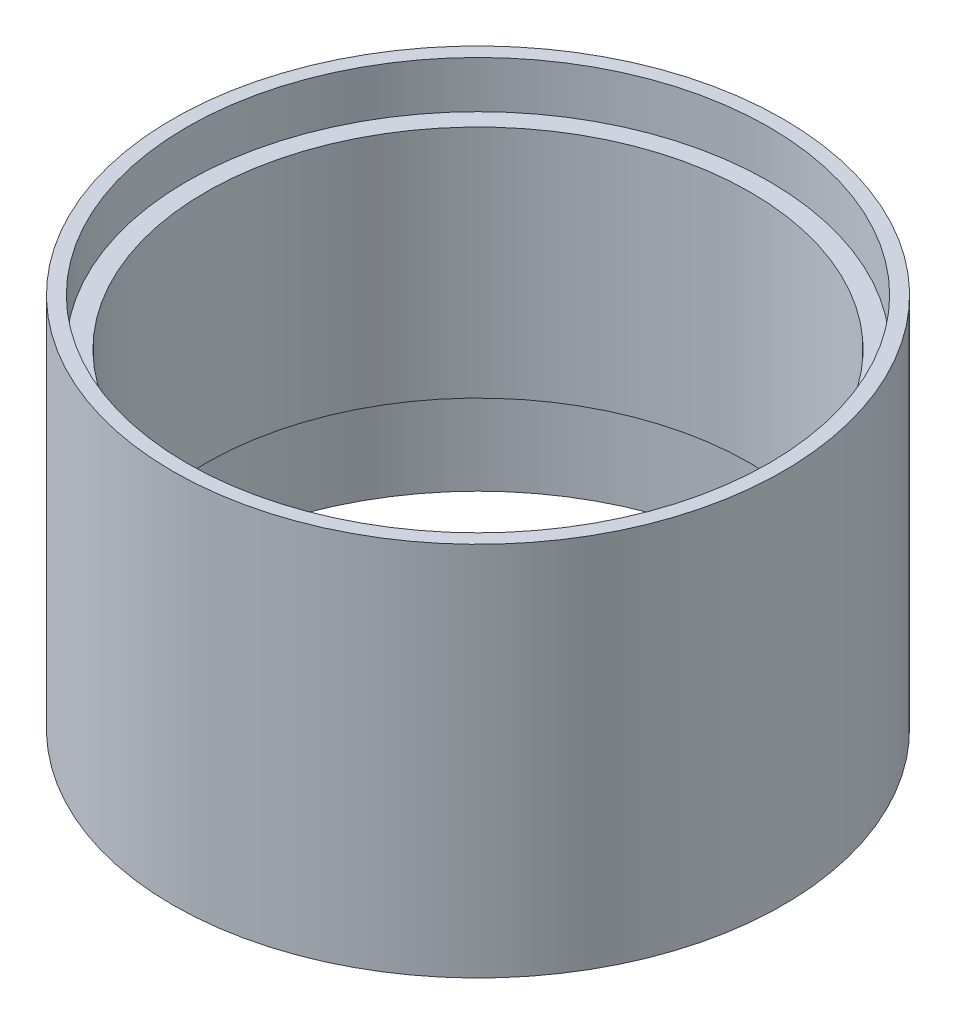
ISO-10303-21;
HEADER;
FILE_DESCRIPTION(('STEP AP214'),'2;1');
FILE_NAME('part.step','',(''),(''),'','','');
FILE_SCHEMA(('AUTOMOTIVE_DESIGN { 1 0 10303 214 1 1 1 1 }'));
ENDSEC;
DATA;
#1=APPLICATION_CONTEXT('core data for automotive mechanical design processes');
#2=APPLICATION_PROTOCOL_DEFINITION('international standard','automotive_design',2000,#1);
#3=PRODUCT_CONTEXT('',#1,'mechanical');
#4=PRODUCT('Part','Part','',(#3));
#5=PRODUCT_RELATED_PRODUCT_CATEGORY('part','',(#4));
#6=PRODUCT_DEFINITION_FORMATION('','',#4);
#7=PRODUCT_DEFINITION_CONTEXT('part definition',#1,'design');
#8=PRODUCT_DEFINITION('design','',#6,#7);
#9=PRODUCT_DEFINITION_SHAPE('','',#8);
#10=(LENGTH_UNIT() NAMED_UNIT(*) SI_UNIT(.MILLI.,.METRE.));
#11=(NAMED_UNIT(*) PLANE_ANGLE_UNIT() SI_UNIT($,.RADIAN.));
#12=(NAMED_UNIT(*) SI_UNIT($,.STERADIAN.) SOLID_ANGLE_UNIT());
#13=UNCERTAINTY_MEASURE_WITH_UNIT(LENGTH_MEASURE(1.E-05),#10,'distance_accuracy_value','');
#14=(GEOMETRIC_REPRESENTATION_CONTEXT(3) GLOBAL_UNCERTAINTY_ASSIGNED_CONTEXT((#13)) GLOBAL_UNIT_ASSIGNED_CONTEXT((#10,
#11,#12)) REPRESENTATION_CONTEXT('',''));
#15=CARTESIAN_POINT('',(0.,0.,0.));
#16=DIRECTION('',(0.,0.,1.));
#17=DIRECTION('',(1.,0.,0.));
#18=AXIS2_PLACEMENT_3D('',#15,#16,#17);
#19=CARTESIAN_POINT('',(0.,0.,0.));
#20=DIRECTION('',(0.,-1.,0.));
#21=DIRECTION('',(0.,0.,-1.));
#22=AXIS2_PLACEMENT_3D('',#19,#20,#21);
#23=CYLINDRICAL_SURFACE('',#22,62.);
#24=CARTESIAN_POINT('',(0.,70.,0.));
#25=DIRECTION('',(0.,-1.,0.));
#26=DIRECTION('',(0.,0.,-1.));
#27=AXIS2_PLACEMENT_3D('',#24,#25,#26);
#28=CIRCLE('',#27,62.);
#29=CARTESIAN_POINT('',(0.,70.,-62.));
#30=VERTEX_POINT('',#29);
#31=EDGE_CURVE('E69',#30,#30,#28,.T.);
#32=ORIENTED_EDGE('',*,*,#31,.T.);
#33=EDGE_LOOP('',(#32));
#34=FACE_BOUND('',#33,.T.);
#35=CARTESIAN_POINT('',(0.,80.,0.));
#36=DIRECTION('',(0.,-1.,0.));
#37=DIRECTION('',(0.,0.,-1.));
#38=AXIS2_PLACEMENT_3D('',#35,#36,#37);
#39=CIRCLE('',#38,62.);
#40=CARTESIAN_POINT('',(0.,80.,-62.));
#41=VERTEX_POINT('',#40);
#42=EDGE_CURVE('E10',#41,#41,#39,.T.);
#43=ORIENTED_EDGE('',*,*,#42,.F.);
#44=EDGE_LOOP('',(#43));
#45=FACE_BOUND('',#44,.T.);
#46=ADVANCED_FACE('F41',(#34,#45),#23,.F.);
#47=CARTESIAN_POINT('',(0.,80.,0.));
#48=DIRECTION('',(0.,1.,0.));
#49=DIRECTION('',(0.,0.,1.));
#50=AXIS2_PLACEMENT_3D('',#47,#48,#49);
#51=PLANE('',#50);
#52=ORIENTED_EDGE('',*,*,#42,.T.);
#53=EDGE_LOOP('',(#52));
#54=FACE_BOUND('',#53,.T.);
#55=CARTESIAN_POINT('',(0.,80.,0.));
#56=DIRECTION('',(0.,-1.,0.));
#57=DIRECTION('',(0.,0.,-1.));
#58=AXIS2_PLACEMENT_3D('',#55,#56,#57);
#59=CIRCLE('',#58,65.);
#60=CARTESIAN_POINT('',(0.,80.,-65.));
#61=VERTEX_POINT('',#60);
#62=EDGE_CURVE('E47',#61,#61,#59,.T.);
#63=ORIENTED_EDGE('',*,*,#62,.F.);
#64=EDGE_LOOP('',(#63));
#65=FACE_BOUND('',#64,.T.);
#66=ADVANCED_FACE('F105',(#54,#65),#51,.T.);
#67=CARTESIAN_POINT('',(0.,0.,0.));
#68=DIRECTION('',(0.,-1.,0.));
#69=DIRECTION('',(0.,0.,-1.));
#70=AXIS2_PLACEMENT_3D('',#67,#68,#69);
#71=CYLINDRICAL_SURFACE('',#70,65.);
#72=ORIENTED_EDGE('',*,*,#62,.T.);
#73=EDGE_LOOP('',(#72));
#74=FACE_BOUND('',#73,.T.);
#75=CARTESIAN_POINT('',(0.,0.,0.));
#76=DIRECTION('',(0.,-1.,0.));
#77=DIRECTION('',(0.,0.,-1.));
#78=AXIS2_PLACEMENT_3D('',#75,#76,#77);
#79=CIRCLE('',#78,65.);
#80=CARTESIAN_POINT('',(0.,0.,-65.));
#81=VERTEX_POINT('',#80);
#82=EDGE_CURVE('E51',#81,#81,#79,.T.);
#83=ORIENTED_EDGE('',*,*,#82,.F.);
#84=EDGE_LOOP('',(#83));
#85=FACE_BOUND('',#84,.T.);
#86=ADVANCED_FACE('F101',(#74,#85),#71,.T.);
#87=CARTESIAN_POINT('',(0.,0.,0.));
#88=DIRECTION('',(0.,-1.,0.));
#89=DIRECTION('',(0.,0.,-1.));
#90=AXIS2_PLACEMENT_3D('',#87,#88,#89);
#91=PLANE('',#90);
#92=ORIENTED_EDGE('',*,*,#82,.T.);
#93=EDGE_LOOP('',(#92));
#94=FACE_BOUND('',#93,.T.);
#95=CARTESIAN_POINT('',(0.,0.,0.));
#96=DIRECTION('',(0.,-1.,0.));
#97=DIRECTION('',(0.,0.,-1.));
#98=AXIS2_PLACEMENT_3D('',#95,#96,#97);
#99=CIRCLE('',#98,62.);
#100=CARTESIAN_POINT('',(0.,0.,-62.));
#101=VERTEX_POINT('',#100);
#102=EDGE_CURVE('E55',#101,#101,#99,.T.);
#103=ORIENTED_EDGE('',*,*,#102,.F.);
#104=EDGE_LOOP('',(#103));
#105=FACE_BOUND('',#104,.T.);
#106=ADVANCED_FACE('F95',(#94,#105),#91,.T.);
#107=CARTESIAN_POINT('',(0.,0.,0.));
#108=DIRECTION('',(0.,-1.,0.));
#109=DIRECTION('',(0.,0.,-1.));
#110=AXIS2_PLACEMENT_3D('',#107,#108,#109);
#111=CYLINDRICAL_SURFACE('',#110,62.);
#112=ORIENTED_EDGE('',*,*,#102,.T.);
#113=EDGE_LOOP('',(#112));
#114=FACE_BOUND('',#113,.T.);
#115=CARTESIAN_POINT('',(0.,20.,0.));
#116=DIRECTION('',(0.,-1.,0.));
#117=DIRECTION('',(0.,0.,-1.));
#118=AXIS2_PLACEMENT_3D('',#115,#116,#117);
#119=CIRCLE('',#118,62.);
#120=CARTESIAN_POINT('',(0.,20.,-62.));
#121=VERTEX_POINT('',#120);
#122=EDGE_CURVE('E60',#121,#121,#119,.T.);
#123=ORIENTED_EDGE('',*,*,#122,.F.);
#124=EDGE_LOOP('',(#123));
#125=FACE_BOUND('',#124,.T.);
#126=ADVANCED_FACE('F90',(#114,#125),#111,.F.);
#127=CARTESIAN_POINT('',(0.,20.,0.));
#128=DIRECTION('',(0.,1.,0.));
#129=DIRECTION('',(0.,0.,1.));
#130=AXIS2_PLACEMENT_3D('',#127,#128,#129);
#131=PLANE('',#130);
#132=CARTESIAN_POINT('',(0.,20.,0.));
#133=DIRECTION('',(0.,-1.,0.));
#134=DIRECTION('',(0.,0.,-1.));
#135=AXIS2_PLACEMENT_3D('',#132,#133,#134);
#136=CIRCLE('',#135,58.);
#137=CARTESIAN_POINT('',(0.,20.,-58.));
#138=VERTEX_POINT('',#137);
#139=EDGE_CURVE('E63',#138,#138,#136,.T.);
#140=ORIENTED_EDGE('',*,*,#139,.F.);
#141=EDGE_LOOP('',(#140));
#142=FACE_BOUND('',#141,.T.);
#143=ORIENTED_EDGE('',*,*,#122,.T.);
#144=EDGE_LOOP('',(#143));
#145=FACE_BOUND('',#144,.T.);
#146=ADVANCED_FACE('F84',(#142,#145),#131,.F.);
#147=CARTESIAN_POINT('',(0.,0.,0.));
#148=DIRECTION('',(0.,-1.,0.));
#149=DIRECTION('',(0.,0.,-1.));
#150=AXIS2_PLACEMENT_3D('',#147,#148,#149);
#151=CYLINDRICAL_SURFACE('',#150,58.);
#152=CARTESIAN_POINT('',(0.,70.,0.));
#153=DIRECTION('',(0.,-1.,0.));
#154=DIRECTION('',(0.,0.,-1.));
#155=AXIS2_PLACEMENT_3D('',#152,#153,#154);
#156=CIRCLE('',#155,58.);
#157=CARTESIAN_POINT('',(0.,70.,-58.));
#158=VERTEX_POINT('',#157);
#159=EDGE_CURVE('E66',#158,#158,#156,.T.);
#160=ORIENTED_EDGE('',*,*,#159,.F.);
#161=EDGE_LOOP('',(#160));
#162=FACE_BOUND('',#161,.T.);
#163=ORIENTED_EDGE('',*,*,#139,.T.);
#164=EDGE_LOOP('',(#163));
#165=FACE_BOUND('',#164,.T.);
#166=ADVANCED_FACE('F78',(#162,#165),#151,.F.);
#167=CARTESIAN_POINT('',(0.,70.,0.));
#168=DIRECTION('',(0.,-1.,0.));
#169=DIRECTION('',(0.,0.,-1.));
#170=AXIS2_PLACEMENT_3D('',#167,#168,#169);
#171=PLANE('',#170);
#172=ORIENTED_EDGE('',*,*,#31,.F.);
#173=EDGE_LOOP('',(#172));
#174=FACE_BOUND('',#173,.T.);
#175=ORIENTED_EDGE('',*,*,#159,.T.);
#176=EDGE_LOOP('',(#175));
#177=FACE_BOUND('',#176,.T.);
#178=ADVANCED_FACE('F75',(#174,#177),#171,.F.);
#179=CLOSED_SHELL('',(#46,#66,#86,#106,#126,#146,#166,#178));
#180=MANIFOLD_SOLID_BREP('B2',#179);
#181=ADVANCED_BREP_SHAPE_REPRESENTATION('',(#18,#180),#14);
#182=SHAPE_DEFINITION_REPRESENTATION(#9,#181);
ENDSEC;
END-ISO-10303-21;
